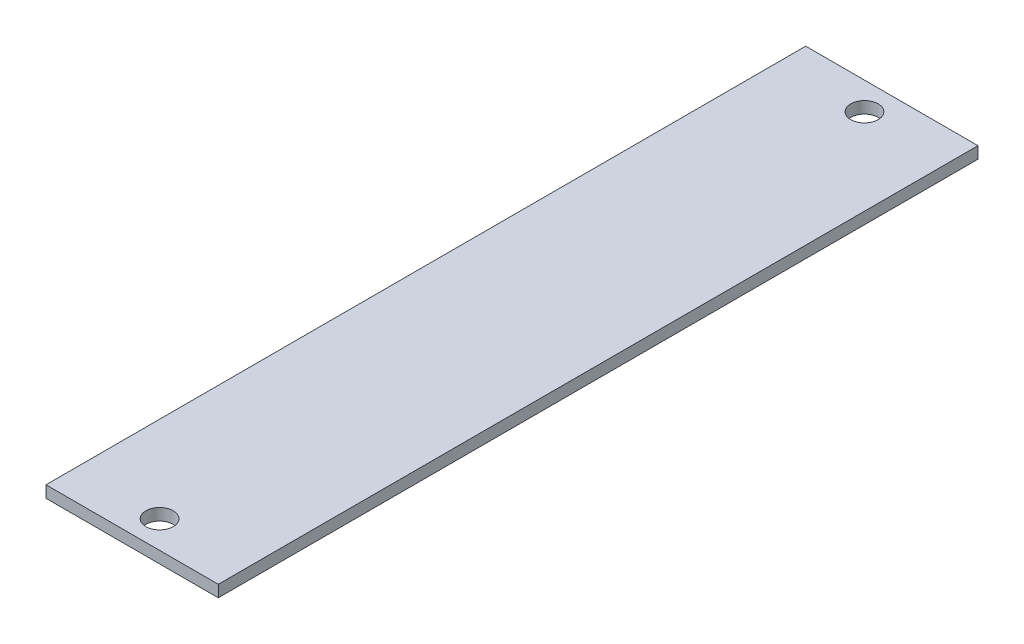
ISO-10303-21;
HEADER;
FILE_DESCRIPTION(('STEP AP214'),'2;1');
FILE_NAME('part.step','',(''),(''),'','','');
FILE_SCHEMA(('AUTOMOTIVE_DESIGN { 1 0 10303 214 1 1 1 1 }'));
ENDSEC;
DATA;
#1=APPLICATION_CONTEXT('core data for automotive mechanical design processes');
#2=APPLICATION_PROTOCOL_DEFINITION('international standard','automotive_design',2000,#1);
#3=PRODUCT_CONTEXT('',#1,'mechanical');
#4=PRODUCT('Part','Part','',(#3));
#5=PRODUCT_RELATED_PRODUCT_CATEGORY('part','',(#4));
#6=PRODUCT_DEFINITION_FORMATION('','',#4);
#7=PRODUCT_DEFINITION_CONTEXT('part definition',#1,'design');
#8=PRODUCT_DEFINITION('design','',#6,#7);
#9=PRODUCT_DEFINITION_SHAPE('','',#8);
#10=(LENGTH_UNIT() NAMED_UNIT(*) SI_UNIT(.MILLI.,.METRE.));
#11=(NAMED_UNIT(*) PLANE_ANGLE_UNIT() SI_UNIT($,.RADIAN.));
#12=(NAMED_UNIT(*) SI_UNIT($,.STERADIAN.) SOLID_ANGLE_UNIT());
#13=UNCERTAINTY_MEASURE_WITH_UNIT(LENGTH_MEASURE(1.E-05),#10,'distance_accuracy_value','');
#14=(GEOMETRIC_REPRESENTATION_CONTEXT(3) GLOBAL_UNCERTAINTY_ASSIGNED_CONTEXT((#13)) GLOBAL_UNIT_ASSIGNED_CONTEXT((#10,
#11,#12)) REPRESENTATION_CONTEXT('',''));
#15=CARTESIAN_POINT('',(0.,0.,0.));
#16=DIRECTION('',(0.,0.,1.));
#17=DIRECTION('',(1.,0.,0.));
#18=AXIS2_PLACEMENT_3D('',#15,#16,#17);
#19=CARTESIAN_POINT('',(-11.,1.5,48.5));
#20=DIRECTION('',(-1.,0.,0.));
#21=DIRECTION('',(0.,0.,1.));
#22=AXIS2_PLACEMENT_3D('',#19,#20,#21);
#23=PLANE('',#22);
#24=DIRECTION('',(0.,0.,-1.));
#25=VECTOR('',#24,1.);
#26=CARTESIAN_POINT('',(-11.,0.,48.5));
#27=LINE('',#26,#25);
#28=CARTESIAN_POINT('',(-11.,0.,48.5));
#29=VERTEX_POINT('',#28);
#30=CARTESIAN_POINT('',(-11.,0.,-48.5));
#31=VERTEX_POINT('',#30);
#32=EDGE_CURVE('E117',#29,#31,#27,.T.);
#33=ORIENTED_EDGE('',*,*,#32,.F.);
#34=DIRECTION('',(0.,-1.,0.));
#35=VECTOR('',#34,1.);
#36=CARTESIAN_POINT('',(-11.,1.5,48.5));
#37=LINE('',#36,#35);
#38=CARTESIAN_POINT('',(-11.,1.5,48.5));
#39=VERTEX_POINT('',#38);
#40=EDGE_CURVE('E11',#39,#29,#37,.T.);
#41=ORIENTED_EDGE('',*,*,#40,.F.);
#42=DIRECTION('',(0.,0.,-1.));
#43=VECTOR('',#42,1.);
#44=CARTESIAN_POINT('',(-11.,1.5,48.5));
#45=LINE('',#44,#43);
#46=CARTESIAN_POINT('',(-11.,1.5,-48.5));
#47=VERTEX_POINT('',#46);
#48=EDGE_CURVE('E109',#39,#47,#45,.T.);
#49=ORIENTED_EDGE('',*,*,#48,.T.);
#50=DIRECTION('',(0.,-1.,0.));
#51=VECTOR('',#50,1.);
#52=CARTESIAN_POINT('',(-11.,1.5,-48.5));
#53=LINE('',#52,#51);
#54=EDGE_CURVE('E48',#47,#31,#53,.T.);
#55=ORIENTED_EDGE('',*,*,#54,.T.);
#56=EDGE_LOOP('',(#33,#41,#49,#55));
#57=FACE_BOUND('',#56,.T.);
#58=ADVANCED_FACE('F45',(#57),#23,.T.);
#59=CARTESIAN_POINT('',(-11.,1.5,48.5));
#60=DIRECTION('',(0.,0.,-1.));
#61=DIRECTION('',(-1.,0.,0.));
#62=AXIS2_PLACEMENT_3D('',#59,#60,#61);
#63=PLANE('',#62);
#64=DIRECTION('',(1.,0.,0.));
#65=VECTOR('',#64,1.);
#66=CARTESIAN_POINT('',(-11.,0.,48.5));
#67=LINE('',#66,#65);
#68=CARTESIAN_POINT('',(11.,0.,48.5));
#69=VERTEX_POINT('',#68);
#70=EDGE_CURVE('E79',#29,#69,#67,.T.);
#71=ORIENTED_EDGE('',*,*,#70,.T.);
#72=DIRECTION('',(0.,-1.,0.));
#73=VECTOR('',#72,1.);
#74=CARTESIAN_POINT('',(11.,1.5,48.5));
#75=LINE('',#74,#73);
#76=CARTESIAN_POINT('',(11.,1.5,48.5));
#77=VERTEX_POINT('',#76);
#78=EDGE_CURVE('E55',#77,#69,#75,.T.);
#79=ORIENTED_EDGE('',*,*,#78,.F.);
#80=DIRECTION('',(1.,0.,0.));
#81=VECTOR('',#80,1.);
#82=CARTESIAN_POINT('',(-11.,1.5,48.5));
#83=LINE('',#82,#81);
#84=EDGE_CURVE('E96',#39,#77,#83,.T.);
#85=ORIENTED_EDGE('',*,*,#84,.F.);
#86=ORIENTED_EDGE('',*,*,#40,.T.);
#87=EDGE_LOOP('',(#71,#79,#85,#86));
#88=FACE_BOUND('',#87,.T.);
#89=ADVANCED_FACE('F134',(#88),#63,.F.);
#90=CARTESIAN_POINT('',(11.,1.5,48.5));
#91=DIRECTION('',(-1.,0.,0.));
#92=DIRECTION('',(0.,0.,1.));
#93=AXIS2_PLACEMENT_3D('',#90,#91,#92);
#94=PLANE('',#93);
#95=DIRECTION('',(0.,0.,-1.));
#96=VECTOR('',#95,1.);
#97=CARTESIAN_POINT('',(11.,0.,48.5));
#98=LINE('',#97,#96);
#99=CARTESIAN_POINT('',(11.,0.,-48.5));
#100=VERTEX_POINT('',#99);
#101=EDGE_CURVE('E104',#69,#100,#98,.T.);
#102=ORIENTED_EDGE('',*,*,#101,.T.);
#103=DIRECTION('',(0.,-1.,0.));
#104=VECTOR('',#103,1.);
#105=CARTESIAN_POINT('',(11.,1.5,-48.5));
#106=LINE('',#105,#104);
#107=CARTESIAN_POINT('',(11.,1.5,-48.5));
#108=VERTEX_POINT('',#107);
#109=EDGE_CURVE('E101',#108,#100,#106,.T.);
#110=ORIENTED_EDGE('',*,*,#109,.F.);
#111=DIRECTION('',(0.,0.,-1.));
#112=VECTOR('',#111,1.);
#113=CARTESIAN_POINT('',(11.,1.5,48.5));
#114=LINE('',#113,#112);
#115=EDGE_CURVE('E91',#77,#108,#114,.T.);
#116=ORIENTED_EDGE('',*,*,#115,.F.);
#117=ORIENTED_EDGE('',*,*,#78,.T.);
#118=EDGE_LOOP('',(#102,#110,#116,#117));
#119=FACE_BOUND('',#118,.T.);
#120=ADVANCED_FACE('F102',(#119),#94,.F.);
#121=CARTESIAN_POINT('',(-11.,1.5,-48.5));
#122=DIRECTION('',(0.,0.,-1.));
#123=DIRECTION('',(-1.,0.,0.));
#124=AXIS2_PLACEMENT_3D('',#121,#122,#123);
#125=PLANE('',#124);
#126=DIRECTION('',(1.,0.,0.));
#127=VECTOR('',#126,1.);
#128=CARTESIAN_POINT('',(-11.,0.,-48.5));
#129=LINE('',#128,#127);
#130=EDGE_CURVE('E121',#31,#100,#129,.T.);
#131=ORIENTED_EDGE('',*,*,#130,.F.);
#132=ORIENTED_EDGE('',*,*,#54,.F.);
#133=DIRECTION('',(1.,0.,0.));
#134=VECTOR('',#133,1.);
#135=CARTESIAN_POINT('',(-11.,1.5,-48.5));
#136=LINE('',#135,#134);
#137=EDGE_CURVE('E95',#47,#108,#136,.T.);
#138=ORIENTED_EDGE('',*,*,#137,.T.);
#139=ORIENTED_EDGE('',*,*,#109,.T.);
#140=EDGE_LOOP('',(#131,#132,#138,#139));
#141=FACE_BOUND('',#140,.T.);
#142=ADVANCED_FACE('F107',(#141),#125,.T.);
#143=CARTESIAN_POINT('',(0.,1.5,0.));
#144=DIRECTION('',(0.,-1.,0.));
#145=DIRECTION('',(0.,0.,-1.));
#146=AXIS2_PLACEMENT_3D('',#143,#144,#145);
#147=PLANE('',#146);
#148=CARTESIAN_POINT('',(0.,1.5,-45.));
#149=DIRECTION('',(0.,1.,0.));
#150=DIRECTION('',(0.,0.,1.));
#151=AXIS2_PLACEMENT_3D('',#148,#149,#150);
#152=CIRCLE('',#151,1.75);
#153=CARTESIAN_POINT('',(0.,1.5,-43.25));
#154=VERTEX_POINT('',#153);
#155=EDGE_CURVE('E170',#154,#154,#152,.T.);
#156=ORIENTED_EDGE('',*,*,#155,.F.);
#157=EDGE_LOOP('',(#156));
#158=FACE_BOUND('',#157,.T.);
#159=CARTESIAN_POINT('',(0.,1.5,45.));
#160=DIRECTION('',(0.,1.,0.));
#161=DIRECTION('',(0.,0.,1.));
#162=AXIS2_PLACEMENT_3D('',#159,#160,#161);
#163=CIRCLE('',#162,1.75);
#164=CARTESIAN_POINT('',(0.,1.5,46.75));
#165=VERTEX_POINT('',#164);
#166=EDGE_CURVE('E172',#165,#165,#163,.T.);
#167=ORIENTED_EDGE('',*,*,#166,.F.);
#168=EDGE_LOOP('',(#167));
#169=FACE_BOUND('',#168,.T.);
#170=ORIENTED_EDGE('',*,*,#48,.F.);
#171=ORIENTED_EDGE('',*,*,#84,.T.);
#172=ORIENTED_EDGE('',*,*,#115,.T.);
#173=ORIENTED_EDGE('',*,*,#137,.F.);
#174=EDGE_LOOP('',(#170,#171,#172,#173));
#175=FACE_BOUND('',#174,.T.);
#176=ADVANCED_FACE('F94',(#158,#169,#175),#147,.F.);
#177=CARTESIAN_POINT('',(0.,0.,0.));
#178=DIRECTION('',(0.,-1.,0.));
#179=DIRECTION('',(0.,0.,-1.));
#180=AXIS2_PLACEMENT_3D('',#177,#178,#179);
#181=PLANE('',#180);
#182=CARTESIAN_POINT('',(0.,0.,-45.));
#183=DIRECTION('',(0.,1.,0.));
#184=DIRECTION('',(0.,0.,1.));
#185=AXIS2_PLACEMENT_3D('',#182,#183,#184);
#186=CIRCLE('',#185,1.75);
#187=CARTESIAN_POINT('',(0.,0.,-43.25));
#188=VERTEX_POINT('',#187);
#189=EDGE_CURVE('E122',#188,#188,#186,.T.);
#190=ORIENTED_EDGE('',*,*,#189,.T.);
#191=EDGE_LOOP('',(#190));
#192=FACE_BOUND('',#191,.T.);
#193=CARTESIAN_POINT('',(0.,0.,45.));
#194=DIRECTION('',(0.,1.,0.));
#195=DIRECTION('',(0.,0.,1.));
#196=AXIS2_PLACEMENT_3D('',#193,#194,#195);
#197=CIRCLE('',#196,1.75);
#198=CARTESIAN_POINT('',(0.,0.,46.75));
#199=VERTEX_POINT('',#198);
#200=EDGE_CURVE('E178',#199,#199,#197,.T.);
#201=ORIENTED_EDGE('',*,*,#200,.T.);
#202=EDGE_LOOP('',(#201));
#203=FACE_BOUND('',#202,.T.);
#204=ORIENTED_EDGE('',*,*,#32,.T.);
#205=ORIENTED_EDGE('',*,*,#130,.T.);
#206=ORIENTED_EDGE('',*,*,#101,.F.);
#207=ORIENTED_EDGE('',*,*,#70,.F.);
#208=EDGE_LOOP('',(#204,#205,#206,#207));
#209=FACE_BOUND('',#208,.T.);
#210=ADVANCED_FACE('F131',(#192,#203,#209),#181,.T.);
#211=CARTESIAN_POINT('',(0.,0.,45.));
#212=DIRECTION('',(0.,1.,0.));
#213=DIRECTION('',(0.,0.,1.));
#214=AXIS2_PLACEMENT_3D('',#211,#212,#213);
#215=CYLINDRICAL_SURFACE('',#214,1.75);
#216=ORIENTED_EDGE('',*,*,#200,.F.);
#217=EDGE_LOOP('',(#216));
#218=FACE_BOUND('',#217,.T.);
#219=ORIENTED_EDGE('',*,*,#166,.T.);
#220=EDGE_LOOP('',(#219));
#221=FACE_BOUND('',#220,.T.);
#222=ADVANCED_FACE('F153',(#218,#221),#215,.F.);
#223=CARTESIAN_POINT('',(0.,0.,-45.));
#224=DIRECTION('',(0.,1.,0.));
#225=DIRECTION('',(0.,0.,1.));
#226=AXIS2_PLACEMENT_3D('',#223,#224,#225);
#227=CYLINDRICAL_SURFACE('',#226,1.75);
#228=ORIENTED_EDGE('',*,*,#189,.F.);
#229=EDGE_LOOP('',(#228));
#230=FACE_BOUND('',#229,.T.);
#231=ORIENTED_EDGE('',*,*,#155,.T.);
#232=EDGE_LOOP('',(#231));
#233=FACE_BOUND('',#232,.T.);
#234=ADVANCED_FACE('F160',(#230,#233),#227,.F.);
#235=CLOSED_SHELL('',(#58,#89,#120,#142,#176,#210,#222,#234));
#236=MANIFOLD_SOLID_BREP('B2',#235);
#237=ADVANCED_BREP_SHAPE_REPRESENTATION('',(#18,#236),#14);
#238=SHAPE_DEFINITION_REPRESENTATION(#9,#237);
ENDSEC;
END-ISO-10303-21;
